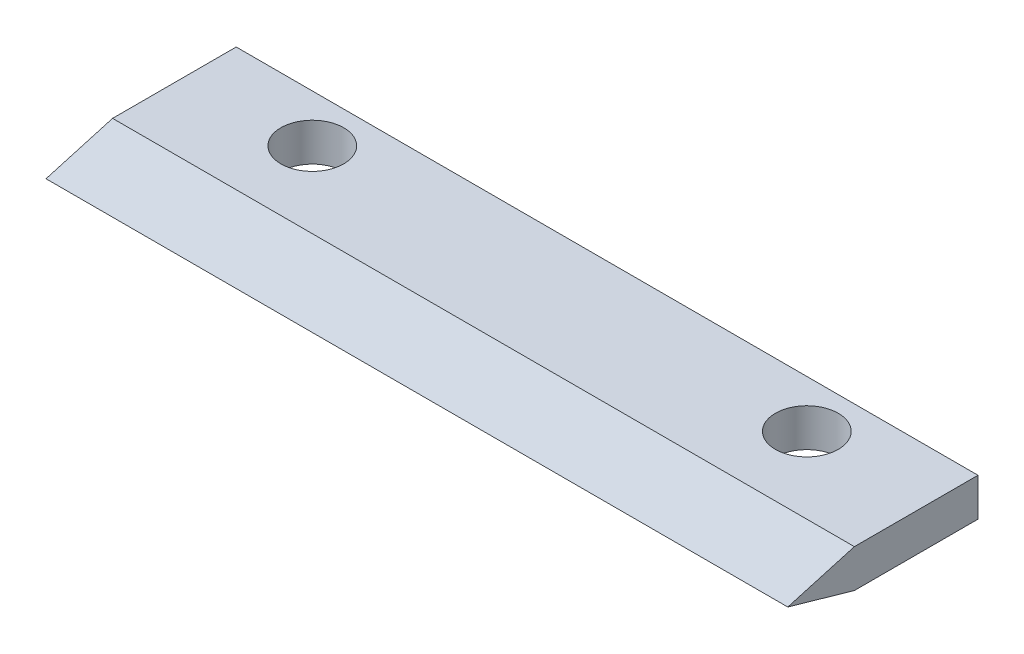
ISO-10303-21;
HEADER;
FILE_DESCRIPTION(('STEP AP214'),'2;1');
FILE_NAME('part.step','',(''),(''),'','','');
FILE_SCHEMA(('AUTOMOTIVE_DESIGN { 1 0 10303 214 1 1 1 1 }'));
ENDSEC;
DATA;
#1=APPLICATION_CONTEXT('core data for automotive mechanical design processes');
#2=APPLICATION_PROTOCOL_DEFINITION('international standard','automotive_design',2000,#1);
#3=PRODUCT_CONTEXT('',#1,'mechanical');
#4=PRODUCT('Part','Part','',(#3));
#5=PRODUCT_RELATED_PRODUCT_CATEGORY('part','',(#4));
#6=PRODUCT_DEFINITION_FORMATION('','',#4);
#7=PRODUCT_DEFINITION_CONTEXT('part definition',#1,'design');
#8=PRODUCT_DEFINITION('design','',#6,#7);
#9=PRODUCT_DEFINITION_SHAPE('','',#8);
#10=(LENGTH_UNIT() NAMED_UNIT(*) SI_UNIT(.MILLI.,.METRE.));
#11=(NAMED_UNIT(*) PLANE_ANGLE_UNIT() SI_UNIT($,.RADIAN.));
#12=(NAMED_UNIT(*) SI_UNIT($,.STERADIAN.) SOLID_ANGLE_UNIT());
#13=UNCERTAINTY_MEASURE_WITH_UNIT(LENGTH_MEASURE(1.E-05),#10,'distance_accuracy_value','');
#14=(GEOMETRIC_REPRESENTATION_CONTEXT(3) GLOBAL_UNCERTAINTY_ASSIGNED_CONTEXT((#13)) GLOBAL_UNIT_ASSIGNED_CONTEXT((#10,
#11,#12)) REPRESENTATION_CONTEXT('',''));
#15=CARTESIAN_POINT('',(0.,0.,0.));
#16=DIRECTION('',(0.,0.,1.));
#17=DIRECTION('',(1.,0.,0.));
#18=AXIS2_PLACEMENT_3D('',#15,#16,#17);
#19=CARTESIAN_POINT('',(0.,2.,0.));
#20=DIRECTION('',(0.,-1.,0.));
#21=DIRECTION('',(0.,0.,-1.));
#22=AXIS2_PLACEMENT_3D('',#19,#20,#21);
#23=PLANE('',#22);
#24=DIRECTION('',(0.,0.,1.));
#25=VECTOR('',#24,1.);
#26=CARTESIAN_POINT('',(0.,2.,0.));
#27=LINE('',#26,#25);
#28=CARTESIAN_POINT('',(0.,2.,-10.));
#29=VERTEX_POINT('',#28);
#30=CARTESIAN_POINT('',(0.,2.,-3.5));
#31=VERTEX_POINT('',#30);
#32=EDGE_CURVE('E84',#29,#31,#27,.T.);
#33=ORIENTED_EDGE('',*,*,#32,.T.);
#34=DIRECTION('',(1.,0.,0.));
#35=VECTOR('',#34,1.);
#36=CARTESIAN_POINT('',(-3.,2.,-3.5));
#37=LINE('',#36,#35);
#38=CARTESIAN_POINT('',(39.,2.,-3.5));
#39=VERTEX_POINT('',#38);
#40=EDGE_CURVE('E119',#31,#39,#37,.T.);
#41=ORIENTED_EDGE('',*,*,#40,.T.);
#42=DIRECTION('',(0.,0.,-1.));
#43=VECTOR('',#42,1.);
#44=CARTESIAN_POINT('',(39.,2.,0.));
#45=LINE('',#44,#43);
#46=CARTESIAN_POINT('',(39.,2.,-10.));
#47=VERTEX_POINT('',#46);
#48=EDGE_CURVE('E106',#39,#47,#45,.T.);
#49=ORIENTED_EDGE('',*,*,#48,.T.);
#50=DIRECTION('',(-1.,0.,0.));
#51=VECTOR('',#50,1.);
#52=CARTESIAN_POINT('',(0.,2.,-10.));
#53=LINE('',#52,#51);
#54=EDGE_CURVE('E64',#47,#29,#53,.T.);
#55=ORIENTED_EDGE('',*,*,#54,.T.);
#56=EDGE_LOOP('',(#33,#41,#49,#55));
#57=FACE_BOUND('',#56,.T.);
#58=CARTESIAN_POINT('',(6.5,2.,-7.5));
#59=DIRECTION('',(0.,1.,0.));
#60=DIRECTION('',(0.,0.,1.));
#61=AXIS2_PLACEMENT_3D('',#58,#59,#60);
#62=CIRCLE('',#61,1.65);
#63=CARTESIAN_POINT('',(6.5,2.,-5.85));
#64=VERTEX_POINT('',#63);
#65=EDGE_CURVE('E96',#64,#64,#62,.T.);
#66=ORIENTED_EDGE('',*,*,#65,.F.);
#67=EDGE_LOOP('',(#66));
#68=FACE_BOUND('',#67,.T.);
#69=CARTESIAN_POINT('',(32.5,2.,-7.5));
#70=DIRECTION('',(0.,1.,0.));
#71=DIRECTION('',(0.,0.,1.));
#72=AXIS2_PLACEMENT_3D('',#69,#70,#71);
#73=CIRCLE('',#72,1.65);
#74=CARTESIAN_POINT('',(32.5,2.,-5.85));
#75=VERTEX_POINT('',#74);
#76=EDGE_CURVE('E109',#75,#75,#73,.T.);
#77=ORIENTED_EDGE('',*,*,#76,.F.);
#78=EDGE_LOOP('',(#77));
#79=FACE_BOUND('',#78,.T.);
#80=ADVANCED_FACE('F41',(#57,#68,#79),#23,.F.);
#81=CARTESIAN_POINT('',(0.,0.,0.));
#82=DIRECTION('',(0.,-1.,0.));
#83=DIRECTION('',(0.,0.,-1.));
#84=AXIS2_PLACEMENT_3D('',#81,#82,#83);
#85=PLANE('',#84);
#86=DIRECTION('',(1.,0.,0.));
#87=VECTOR('',#86,1.);
#88=CARTESIAN_POINT('',(-3.,0.,-3.50000000000003));
#89=LINE('',#88,#87);
#90=CARTESIAN_POINT('',(0.,0.,-3.50000000000003));
#91=VERTEX_POINT('',#90);
#92=CARTESIAN_POINT('',(39.,0.,-3.50000000000003));
#93=VERTEX_POINT('',#92);
#94=EDGE_CURVE('E97',#91,#93,#89,.T.);
#95=ORIENTED_EDGE('',*,*,#94,.F.);
#96=DIRECTION('',(0.,0.,1.));
#97=VECTOR('',#96,1.);
#98=CARTESIAN_POINT('',(0.,0.,0.));
#99=LINE('',#98,#97);
#100=CARTESIAN_POINT('',(0.,0.,-10.));
#101=VERTEX_POINT('',#100);
#102=EDGE_CURVE('E95',#101,#91,#99,.T.);
#103=ORIENTED_EDGE('',*,*,#102,.F.);
#104=DIRECTION('',(-1.,0.,0.));
#105=VECTOR('',#104,1.);
#106=CARTESIAN_POINT('',(0.,0.,-10.));
#107=LINE('',#106,#105);
#108=CARTESIAN_POINT('',(39.,0.,-10.));
#109=VERTEX_POINT('',#108);
#110=EDGE_CURVE('E80',#109,#101,#107,.T.);
#111=ORIENTED_EDGE('',*,*,#110,.F.);
#112=DIRECTION('',(0.,0.,-1.));
#113=VECTOR('',#112,1.);
#114=CARTESIAN_POINT('',(39.,0.,0.));
#115=LINE('',#114,#113);
#116=EDGE_CURVE('E87',#93,#109,#115,.T.);
#117=ORIENTED_EDGE('',*,*,#116,.F.);
#118=EDGE_LOOP('',(#95,#103,#111,#117));
#119=FACE_BOUND('',#118,.T.);
#120=CARTESIAN_POINT('',(6.5,0.,-7.5));
#121=DIRECTION('',(0.,1.,0.));
#122=DIRECTION('',(0.,0.,1.));
#123=AXIS2_PLACEMENT_3D('',#120,#121,#122);
#124=CIRCLE('',#123,1.65);
#125=CARTESIAN_POINT('',(6.5,0.,-5.85));
#126=VERTEX_POINT('',#125);
#127=EDGE_CURVE('E105',#126,#126,#124,.T.);
#128=ORIENTED_EDGE('',*,*,#127,.T.);
#129=EDGE_LOOP('',(#128));
#130=FACE_BOUND('',#129,.T.);
#131=CARTESIAN_POINT('',(32.5,0.,-7.5));
#132=DIRECTION('',(0.,1.,0.));
#133=DIRECTION('',(0.,0.,1.));
#134=AXIS2_PLACEMENT_3D('',#131,#132,#133);
#135=CIRCLE('',#134,1.65);
#136=CARTESIAN_POINT('',(32.5,0.,-5.85));
#137=VERTEX_POINT('',#136);
#138=EDGE_CURVE('E115',#137,#137,#135,.T.);
#139=ORIENTED_EDGE('',*,*,#138,.T.);
#140=EDGE_LOOP('',(#139));
#141=FACE_BOUND('',#140,.T.);
#142=ADVANCED_FACE('F94',(#119,#130,#141),#85,.T.);
#143=CARTESIAN_POINT('',(0.,2.,0.));
#144=DIRECTION('',(1.,0.,0.));
#145=DIRECTION('',(0.,0.,-1.));
#146=AXIS2_PLACEMENT_3D('',#143,#144,#145);
#147=PLANE('',#146);
#148=ORIENTED_EDGE('',*,*,#102,.T.);
#149=DIRECTION('',(0.,0.274721127897376,0.961523947640824));
#150=VECTOR('',#149,1.);
#151=CARTESIAN_POINT('',(0.,1.07547169811321,0.264150943396225));
#152=LINE('',#151,#150);
#153=CARTESIAN_POINT('',(0.,1.,0.));
#154=VERTEX_POINT('',#153);
#155=EDGE_CURVE('E130',#91,#154,#152,.T.);
#156=ORIENTED_EDGE('',*,*,#155,.T.);
#157=DIRECTION('',(0.,0.27472112789738,-0.961523947640823));
#158=VECTOR('',#157,1.);
#159=CARTESIAN_POINT('',(0.,1.0754716981132,-0.26415094339623));
#160=LINE('',#159,#158);
#161=EDGE_CURVE('E114',#154,#31,#160,.T.);
#162=ORIENTED_EDGE('',*,*,#161,.T.);
#163=ORIENTED_EDGE('',*,*,#32,.F.);
#164=DIRECTION('',(0.,-1.,0.));
#165=VECTOR('',#164,1.);
#166=CARTESIAN_POINT('',(0.,2.,-10.));
#167=LINE('',#166,#165);
#168=EDGE_CURVE('E47',#29,#101,#167,.T.);
#169=ORIENTED_EDGE('',*,*,#168,.T.);
#170=EDGE_LOOP('',(#148,#156,#162,#163,#169));
#171=FACE_BOUND('',#170,.T.);
#172=ADVANCED_FACE('F43',(#171),#147,.F.);
#173=CARTESIAN_POINT('',(39.,2.,0.));
#174=DIRECTION('',(-1.,0.,0.));
#175=DIRECTION('',(0.,0.,1.));
#176=AXIS2_PLACEMENT_3D('',#173,#174,#175);
#177=PLANE('',#176);
#178=DIRECTION('',(0.,0.27472112789738,-0.961523947640823));
#179=VECTOR('',#178,1.);
#180=CARTESIAN_POINT('',(39.,1.,0.));
#181=LINE('',#180,#179);
#182=CARTESIAN_POINT('',(39.,1.,0.));
#183=VERTEX_POINT('',#182);
#184=EDGE_CURVE('E124',#183,#39,#181,.T.);
#185=ORIENTED_EDGE('',*,*,#184,.F.);
#186=DIRECTION('',(0.,0.274721127897376,0.961523947640824));
#187=VECTOR('',#186,1.);
#188=CARTESIAN_POINT('',(39.,0.,-3.50000000000003));
#189=LINE('',#188,#187);
#190=EDGE_CURVE('E57',#93,#183,#189,.T.);
#191=ORIENTED_EDGE('',*,*,#190,.F.);
#192=ORIENTED_EDGE('',*,*,#116,.T.);
#193=DIRECTION('',(0.,-1.,0.));
#194=VECTOR('',#193,1.);
#195=CARTESIAN_POINT('',(39.,2.,-10.));
#196=LINE('',#195,#194);
#197=EDGE_CURVE('E11',#47,#109,#196,.T.);
#198=ORIENTED_EDGE('',*,*,#197,.F.);
#199=ORIENTED_EDGE('',*,*,#48,.F.);
#200=EDGE_LOOP('',(#185,#191,#192,#198,#199));
#201=FACE_BOUND('',#200,.T.);
#202=ADVANCED_FACE('F140',(#201),#177,.F.);
#203=CARTESIAN_POINT('',(0.,2.,-10.));
#204=DIRECTION('',(0.,0.,1.));
#205=DIRECTION('',(1.,0.,0.));
#206=AXIS2_PLACEMENT_3D('',#203,#204,#205);
#207=PLANE('',#206);
#208=ORIENTED_EDGE('',*,*,#110,.T.);
#209=ORIENTED_EDGE('',*,*,#168,.F.);
#210=ORIENTED_EDGE('',*,*,#54,.F.);
#211=ORIENTED_EDGE('',*,*,#197,.T.);
#212=EDGE_LOOP('',(#208,#209,#210,#211));
#213=FACE_BOUND('',#212,.T.);
#214=ADVANCED_FACE('F79',(#213),#207,.F.);
#215=CARTESIAN_POINT('',(6.5,2.,-7.5));
#216=DIRECTION('',(0.,-1.,0.));
#217=DIRECTION('',(0.,0.,-1.));
#218=AXIS2_PLACEMENT_3D('',#215,#216,#217);
#219=CYLINDRICAL_SURFACE('',#218,1.65);
#220=ORIENTED_EDGE('',*,*,#65,.T.);
#221=EDGE_LOOP('',(#220));
#222=FACE_BOUND('',#221,.T.);
#223=ORIENTED_EDGE('',*,*,#127,.F.);
#224=EDGE_LOOP('',(#223));
#225=FACE_BOUND('',#224,.T.);
#226=ADVANCED_FACE('F160',(#222,#225),#219,.F.);
#227=CARTESIAN_POINT('',(32.5,2.,-7.5));
#228=DIRECTION('',(0.,-1.,0.));
#229=DIRECTION('',(0.,0.,-1.));
#230=AXIS2_PLACEMENT_3D('',#227,#228,#229);
#231=CYLINDRICAL_SURFACE('',#230,1.65);
#232=ORIENTED_EDGE('',*,*,#76,.T.);
#233=EDGE_LOOP('',(#232));
#234=FACE_BOUND('',#233,.T.);
#235=ORIENTED_EDGE('',*,*,#138,.F.);
#236=EDGE_LOOP('',(#235));
#237=FACE_BOUND('',#236,.T.);
#238=ADVANCED_FACE('F154',(#234,#237),#231,.F.);
#239=CARTESIAN_POINT('',(-3.,1.,0.));
#240=DIRECTION('',(0.,-0.961523947640822,-0.27472112789738));
#241=DIRECTION('',(0.,0.27472112789738,-0.961523947640823));
#242=AXIS2_PLACEMENT_3D('',#239,#240,#241);
#243=PLANE('',#242);
#244=DIRECTION('',(1.,0.,0.));
#245=VECTOR('',#244,1.);
#246=CARTESIAN_POINT('',(-3.,1.,0.));
#247=LINE('',#246,#245);
#248=EDGE_CURVE('E118',#154,#183,#247,.T.);
#249=ORIENTED_EDGE('',*,*,#248,.T.);
#250=ORIENTED_EDGE('',*,*,#184,.T.);
#251=ORIENTED_EDGE('',*,*,#40,.F.);
#252=ORIENTED_EDGE('',*,*,#161,.F.);
#253=EDGE_LOOP('',(#249,#250,#251,#252));
#254=FACE_BOUND('',#253,.T.);
#255=ADVANCED_FACE('F145',(#254),#243,.F.);
#256=CARTESIAN_POINT('',(-3.,0.,-3.50000000000003));
#257=DIRECTION('',(0.,0.961523947640824,-0.274721127897376));
#258=DIRECTION('',(0.,0.274721127897376,0.961523947640824));
#259=AXIS2_PLACEMENT_3D('',#256,#257,#258);
#260=PLANE('',#259);
#261=ORIENTED_EDGE('',*,*,#94,.T.);
#262=ORIENTED_EDGE('',*,*,#190,.T.);
#263=ORIENTED_EDGE('',*,*,#248,.F.);
#264=ORIENTED_EDGE('',*,*,#155,.F.);
#265=EDGE_LOOP('',(#261,#262,#263,#264));
#266=FACE_BOUND('',#265,.T.);
#267=ADVANCED_FACE('F135',(#266),#260,.F.);
#268=CLOSED_SHELL('',(#80,#142,#172,#202,#214,#226,#238,#255,#267));
#269=MANIFOLD_SOLID_BREP('B2',#268);
#270=ADVANCED_BREP_SHAPE_REPRESENTATION('',(#18,#269),#14);
#271=SHAPE_DEFINITION_REPRESENTATION(#9,#270);
ENDSEC;
END-ISO-10303-21;
